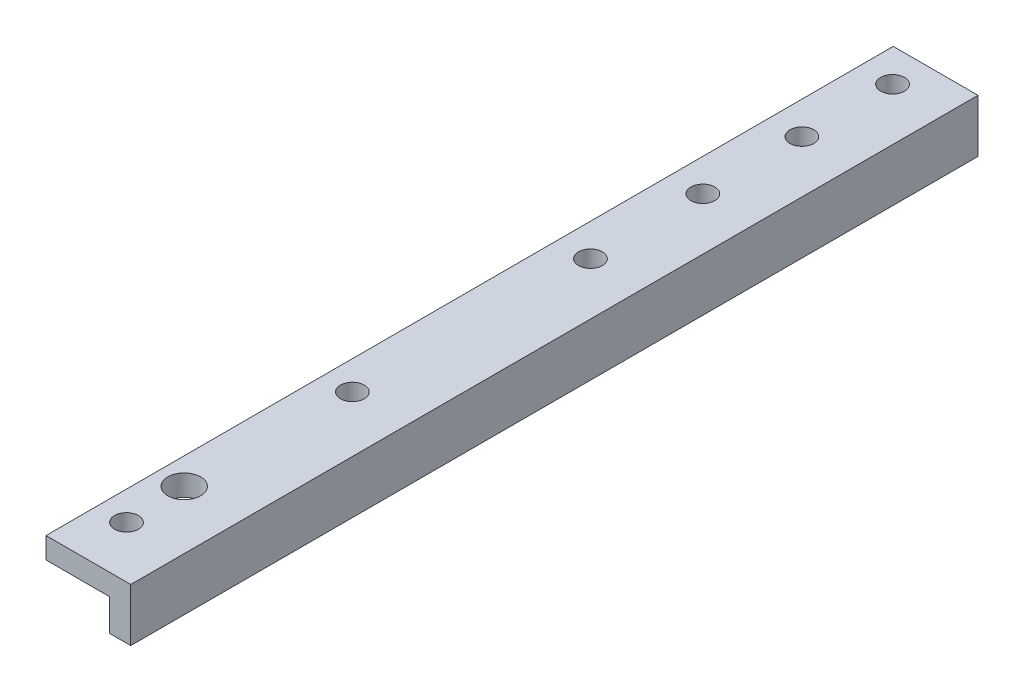
ISO-10303-21;
HEADER;
FILE_DESCRIPTION(('STEP AP214'),'2;1');
FILE_NAME('part.step','',(''),(''),'','','');
FILE_SCHEMA(('AUTOMOTIVE_DESIGN { 1 0 10303 214 1 1 1 1 }'));
ENDSEC;
DATA;
#1=APPLICATION_CONTEXT('core data for automotive mechanical design processes');
#2=APPLICATION_PROTOCOL_DEFINITION('international standard','automotive_design',2000,#1);
#3=PRODUCT_CONTEXT('',#1,'mechanical');
#4=PRODUCT('Part','Part','',(#3));
#5=PRODUCT_RELATED_PRODUCT_CATEGORY('part','',(#4));
#6=PRODUCT_DEFINITION_FORMATION('','',#4);
#7=PRODUCT_DEFINITION_CONTEXT('part definition',#1,'design');
#8=PRODUCT_DEFINITION('design','',#6,#7);
#9=PRODUCT_DEFINITION_SHAPE('','',#8);
#10=(LENGTH_UNIT() NAMED_UNIT(*) SI_UNIT(.MILLI.,.METRE.));
#11=(NAMED_UNIT(*) PLANE_ANGLE_UNIT() SI_UNIT($,.RADIAN.));
#12=(NAMED_UNIT(*) SI_UNIT($,.STERADIAN.) SOLID_ANGLE_UNIT());
#13=UNCERTAINTY_MEASURE_WITH_UNIT(LENGTH_MEASURE(1.E-05),#10,'distance_accuracy_value','');
#14=(GEOMETRIC_REPRESENTATION_CONTEXT(3) GLOBAL_UNCERTAINTY_ASSIGNED_CONTEXT((#13)) GLOBAL_UNIT_ASSIGNED_CONTEXT((#10,
#11,#12)) REPRESENTATION_CONTEXT('',''));
#15=CARTESIAN_POINT('',(0.,0.,0.));
#16=DIRECTION('',(0.,0.,1.));
#17=DIRECTION('',(1.,0.,0.));
#18=AXIS2_PLACEMENT_3D('',#15,#16,#17);
#19=CARTESIAN_POINT('',(16.,-4.,160.));
#20=DIRECTION('',(1.,0.,0.));
#21=DIRECTION('',(0.,0.,-1.));
#22=AXIS2_PLACEMENT_3D('',#19,#20,#21);
#23=PLANE('',#22);
#24=DIRECTION('',(0.,-1.,0.));
#25=VECTOR('',#24,1.);
#26=CARTESIAN_POINT('',(16.,-4.,0.));
#27=LINE('',#26,#25);
#28=CARTESIAN_POINT('',(16.,-4.,0.));
#29=VERTEX_POINT('',#28);
#30=CARTESIAN_POINT('',(16.,-10.,0.));
#31=VERTEX_POINT('',#30);
#32=EDGE_CURVE('E116',#29,#31,#27,.T.);
#33=ORIENTED_EDGE('',*,*,#32,.T.);
#34=DIRECTION('',(0.,0.,-1.));
#35=VECTOR('',#34,1.);
#36=CARTESIAN_POINT('',(16.,-10.,160.));
#37=LINE('',#36,#35);
#38=CARTESIAN_POINT('',(16.,-10.,160.));
#39=VERTEX_POINT('',#38);
#40=EDGE_CURVE('E11',#39,#31,#37,.T.);
#41=ORIENTED_EDGE('',*,*,#40,.F.);
#42=DIRECTION('',(0.,-1.,0.));
#43=VECTOR('',#42,1.);
#44=CARTESIAN_POINT('',(16.,-4.,160.));
#45=LINE('',#44,#43);
#46=CARTESIAN_POINT('',(16.,-4.,160.));
#47=VERTEX_POINT('',#46);
#48=EDGE_CURVE('E128',#47,#39,#45,.T.);
#49=ORIENTED_EDGE('',*,*,#48,.F.);
#50=DIRECTION('',(0.,0.,-1.));
#51=VECTOR('',#50,1.);
#52=CARTESIAN_POINT('',(16.,-4.,160.));
#53=LINE('',#52,#51);
#54=EDGE_CURVE('E112',#47,#29,#53,.T.);
#55=ORIENTED_EDGE('',*,*,#54,.T.);
#56=EDGE_LOOP('',(#33,#41,#49,#55));
#57=FACE_BOUND('',#56,.T.);
#58=ADVANCED_FACE('F33',(#57),#23,.F.);
#59=CARTESIAN_POINT('',(16.,-10.,160.));
#60=DIRECTION('',(0.,1.,0.));
#61=DIRECTION('',(0.,0.,1.));
#62=AXIS2_PLACEMENT_3D('',#59,#60,#61);
#63=PLANE('',#62);
#64=DIRECTION('',(1.,0.,0.));
#65=VECTOR('',#64,1.);
#66=CARTESIAN_POINT('',(16.,-10.,0.));
#67=LINE('',#66,#65);
#68=CARTESIAN_POINT('',(20.,-10.,0.));
#69=VERTEX_POINT('',#68);
#70=EDGE_CURVE('E119',#31,#69,#67,.T.);
#71=ORIENTED_EDGE('',*,*,#70,.T.);
#72=DIRECTION('',(0.,0.,-1.));
#73=VECTOR('',#72,1.);
#74=CARTESIAN_POINT('',(20.,-10.,160.));
#75=LINE('',#74,#73);
#76=CARTESIAN_POINT('',(20.,-10.,160.));
#77=VERTEX_POINT('',#76);
#78=EDGE_CURVE('E41',#77,#69,#75,.T.);
#79=ORIENTED_EDGE('',*,*,#78,.F.);
#80=DIRECTION('',(1.,0.,0.));
#81=VECTOR('',#80,1.);
#82=CARTESIAN_POINT('',(16.,-10.,160.));
#83=LINE('',#82,#81);
#84=EDGE_CURVE('E86',#39,#77,#83,.T.);
#85=ORIENTED_EDGE('',*,*,#84,.F.);
#86=ORIENTED_EDGE('',*,*,#40,.T.);
#87=EDGE_LOOP('',(#71,#79,#85,#86));
#88=FACE_BOUND('',#87,.T.);
#89=ADVANCED_FACE('F155',(#88),#63,.F.);
#90=CARTESIAN_POINT('',(20.,0.,160.));
#91=DIRECTION('',(-1.,0.,0.));
#92=DIRECTION('',(0.,-1.,0.));
#93=AXIS2_PLACEMENT_3D('',#90,#91,#92);
#94=PLANE('',#93);
#95=DIRECTION('',(0.,1.,0.));
#96=VECTOR('',#95,1.);
#97=CARTESIAN_POINT('',(20.,0.,0.));
#98=LINE('',#97,#96);
#99=CARTESIAN_POINT('',(20.,0.,0.));
#100=VERTEX_POINT('',#99);
#101=EDGE_CURVE('E122',#69,#100,#98,.T.);
#102=ORIENTED_EDGE('',*,*,#101,.T.);
#103=DIRECTION('',(0.,0.,-1.));
#104=VECTOR('',#103,1.);
#105=CARTESIAN_POINT('',(20.,0.,160.));
#106=LINE('',#105,#104);
#107=CARTESIAN_POINT('',(20.,0.,160.));
#108=VERTEX_POINT('',#107);
#109=EDGE_CURVE('E107',#108,#100,#106,.T.);
#110=ORIENTED_EDGE('',*,*,#109,.F.);
#111=DIRECTION('',(0.,1.,0.));
#112=VECTOR('',#111,1.);
#113=CARTESIAN_POINT('',(20.,0.,160.));
#114=LINE('',#113,#112);
#115=EDGE_CURVE('E99',#77,#108,#114,.T.);
#116=ORIENTED_EDGE('',*,*,#115,.F.);
#117=ORIENTED_EDGE('',*,*,#78,.T.);
#118=EDGE_LOOP('',(#102,#110,#116,#117));
#119=FACE_BOUND('',#118,.T.);
#120=ADVANCED_FACE('F134',(#119),#94,.F.);
#121=CARTESIAN_POINT('',(16.,0.,160.));
#122=DIRECTION('',(0.,-1.,0.));
#123=DIRECTION('',(1.,0.,0.));
#124=AXIS2_PLACEMENT_3D('',#121,#122,#123);
#125=PLANE('',#124);
#126=CARTESIAN_POINT('',(9.00000000001513,0.,138.89793195105));
#127=DIRECTION('',(0.,-1.,0.));
#128=DIRECTION('',(1.,0.,0.));
#129=AXIS2_PLACEMENT_3D('',#126,#127,#128);
#130=CIRCLE('',#129,3.1);
#131=CARTESIAN_POINT('',(12.1000000000151,0.,138.89793195105));
#132=VERTEX_POINT('',#131);
#133=EDGE_CURVE('E171',#132,#132,#130,.T.);
#134=ORIENTED_EDGE('',*,*,#133,.T.);
#135=EDGE_LOOP('',(#134));
#136=FACE_BOUND('',#135,.T.);
#137=CARTESIAN_POINT('',(10.1289115033545,0.,6.26728637477271));
#138=DIRECTION('',(0.,-1.,0.));
#139=DIRECTION('',(0.,0.,-1.));
#140=AXIS2_PLACEMENT_3D('',#137,#138,#139);
#141=CIRCLE('',#140,2.25);
#142=CARTESIAN_POINT('',(10.1289115033545,0.,4.01728637477272));
#143=VERTEX_POINT('',#142);
#144=EDGE_CURVE('E175',#143,#143,#141,.T.);
#145=ORIENTED_EDGE('',*,*,#144,.T.);
#146=EDGE_LOOP('',(#145));
#147=FACE_BOUND('',#146,.T.);
#148=CARTESIAN_POINT('',(10.1289115033545,0.,23.3815670297532));
#149=DIRECTION('',(0.,-1.,0.));
#150=DIRECTION('',(0.,0.,-1.));
#151=AXIS2_PLACEMENT_3D('',#148,#149,#150);
#152=CIRCLE('',#151,2.25);
#153=CARTESIAN_POINT('',(10.1289115033545,0.,21.1315670297532));
#154=VERTEX_POINT('',#153);
#155=EDGE_CURVE('E179',#154,#154,#152,.T.);
#156=ORIENTED_EDGE('',*,*,#155,.T.);
#157=EDGE_LOOP('',(#156));
#158=FACE_BOUND('',#157,.T.);
#159=CARTESIAN_POINT('',(10.1289115033545,0.,42.0931805458651));
#160=DIRECTION('',(0.,-1.,0.));
#161=DIRECTION('',(0.,0.,-1.));
#162=AXIS2_PLACEMENT_3D('',#159,#160,#161);
#163=CIRCLE('',#162,2.25);
#164=CARTESIAN_POINT('',(10.1289115033545,0.,39.8431805458652));
#165=VERTEX_POINT('',#164);
#166=EDGE_CURVE('E183',#165,#165,#163,.T.);
#167=ORIENTED_EDGE('',*,*,#166,.T.);
#168=EDGE_LOOP('',(#167));
#169=FACE_BOUND('',#168,.T.);
#170=CARTESIAN_POINT('',(10.1289115033545,0.,63.3148885580409));
#171=DIRECTION('',(0.,-1.,0.));
#172=DIRECTION('',(0.,0.,-1.));
#173=AXIS2_PLACEMENT_3D('',#170,#171,#172);
#174=CIRCLE('',#173,2.25);
#175=CARTESIAN_POINT('',(10.1289115033545,0.,61.0648885580409));
#176=VERTEX_POINT('',#175);
#177=EDGE_CURVE('E187',#176,#176,#174,.T.);
#178=ORIENTED_EDGE('',*,*,#177,.T.);
#179=EDGE_LOOP('',(#178));
#180=FACE_BOUND('',#179,.T.);
#181=CARTESIAN_POINT('',(9.44434027715525,0.,107.583827852257));
#182=DIRECTION('',(0.,-1.,0.));
#183=DIRECTION('',(0.,0.,-1.));
#184=AXIS2_PLACEMENT_3D('',#181,#182,#183);
#185=CIRCLE('',#184,2.25);
#186=CARTESIAN_POINT('',(9.44434027715525,0.,105.333827852257));
#187=VERTEX_POINT('',#186);
#188=EDGE_CURVE('E191',#187,#187,#185,.T.);
#189=ORIENTED_EDGE('',*,*,#188,.T.);
#190=EDGE_LOOP('',(#189));
#191=FACE_BOUND('',#190,.T.);
#192=CARTESIAN_POINT('',(9.44434027715525,0.,150.244789298313));
#193=DIRECTION('',(0.,-1.,0.));
#194=DIRECTION('',(0.,0.,-1.));
#195=AXIS2_PLACEMENT_3D('',#192,#193,#194);
#196=CIRCLE('',#195,2.25);
#197=CARTESIAN_POINT('',(9.44434027715525,0.,147.994789298313));
#198=VERTEX_POINT('',#197);
#199=EDGE_CURVE('E120',#198,#198,#196,.T.);
#200=ORIENTED_EDGE('',*,*,#199,.T.);
#201=EDGE_LOOP('',(#200));
#202=FACE_BOUND('',#201,.T.);
#203=DIRECTION('',(-1.,0.,0.));
#204=VECTOR('',#203,1.);
#205=CARTESIAN_POINT('',(16.,0.,0.));
#206=LINE('',#205,#204);
#207=CARTESIAN_POINT('',(4.,0.,0.));
#208=VERTEX_POINT('',#207);
#209=EDGE_CURVE('E106',#100,#208,#206,.T.);
#210=ORIENTED_EDGE('',*,*,#209,.T.);
#211=DIRECTION('',(0.,0.,-1.));
#212=VECTOR('',#211,1.);
#213=CARTESIAN_POINT('',(4.,0.,160.));
#214=LINE('',#213,#212);
#215=CARTESIAN_POINT('',(4.,0.,160.));
#216=VERTEX_POINT('',#215);
#217=EDGE_CURVE('E104',#216,#208,#214,.T.);
#218=ORIENTED_EDGE('',*,*,#217,.F.);
#219=DIRECTION('',(-1.,0.,0.));
#220=VECTOR('',#219,1.);
#221=CARTESIAN_POINT('',(16.,0.,160.));
#222=LINE('',#221,#220);
#223=EDGE_CURVE('E93',#108,#216,#222,.T.);
#224=ORIENTED_EDGE('',*,*,#223,.F.);
#225=ORIENTED_EDGE('',*,*,#109,.T.);
#226=EDGE_LOOP('',(#210,#218,#224,#225));
#227=FACE_BOUND('',#226,.T.);
#228=ADVANCED_FACE('F105',(#136,#147,#158,#169,#180,#191,#202,#227),#125,.F.);
#229=CARTESIAN_POINT('',(4.,0.,160.));
#230=DIRECTION('',(1.,0.,0.));
#231=DIRECTION('',(0.,1.,0.));
#232=AXIS2_PLACEMENT_3D('',#229,#230,#231);
#233=PLANE('',#232);
#234=DIRECTION('',(0.,-1.,0.));
#235=VECTOR('',#234,1.);
#236=CARTESIAN_POINT('',(4.,0.,0.));
#237=LINE('',#236,#235);
#238=CARTESIAN_POINT('',(4.,-4.,0.));
#239=VERTEX_POINT('',#238);
#240=EDGE_CURVE('E72',#208,#239,#237,.T.);
#241=ORIENTED_EDGE('',*,*,#240,.T.);
#242=DIRECTION('',(0.,0.,-1.));
#243=VECTOR('',#242,1.);
#244=CARTESIAN_POINT('',(4.,-4.,160.));
#245=LINE('',#244,#243);
#246=CARTESIAN_POINT('',(4.,-4.,160.));
#247=VERTEX_POINT('',#246);
#248=EDGE_CURVE('E108',#247,#239,#245,.T.);
#249=ORIENTED_EDGE('',*,*,#248,.F.);
#250=DIRECTION('',(0.,-1.,0.));
#251=VECTOR('',#250,1.);
#252=CARTESIAN_POINT('',(4.,0.,160.));
#253=LINE('',#252,#251);
#254=EDGE_CURVE('E97',#216,#247,#253,.T.);
#255=ORIENTED_EDGE('',*,*,#254,.F.);
#256=ORIENTED_EDGE('',*,*,#217,.T.);
#257=EDGE_LOOP('',(#241,#249,#255,#256));
#258=FACE_BOUND('',#257,.T.);
#259=ADVANCED_FACE('F110',(#258),#233,.F.);
#260=CARTESIAN_POINT('',(4.,-4.,160.));
#261=DIRECTION('',(0.,1.,0.));
#262=DIRECTION('',(0.,0.,1.));
#263=AXIS2_PLACEMENT_3D('',#260,#261,#262);
#264=PLANE('',#263);
#265=CARTESIAN_POINT('',(9.00000000001513,-4.,138.89793195105));
#266=DIRECTION('',(0.,-1.,0.));
#267=DIRECTION('',(0.,0.,-1.));
#268=AXIS2_PLACEMENT_3D('',#265,#266,#267);
#269=CIRCLE('',#268,3.1);
#270=CARTESIAN_POINT('',(9.00000000001513,-4.,135.79793195105));
#271=VERTEX_POINT('',#270);
#272=EDGE_CURVE('E223',#271,#271,#269,.T.);
#273=ORIENTED_EDGE('',*,*,#272,.F.);
#274=EDGE_LOOP('',(#273));
#275=FACE_BOUND('',#274,.T.);
#276=CARTESIAN_POINT('',(10.1289115033545,-4.,6.26728637477271));
#277=DIRECTION('',(0.,-1.,0.));
#278=DIRECTION('',(0.,0.,-1.));
#279=AXIS2_PLACEMENT_3D('',#276,#277,#278);
#280=CIRCLE('',#279,2.24999999999999);
#281=CARTESIAN_POINT('',(10.1289115033545,-4.,4.01728637477273));
#282=VERTEX_POINT('',#281);
#283=EDGE_CURVE('E219',#282,#282,#280,.T.);
#284=ORIENTED_EDGE('',*,*,#283,.F.);
#285=EDGE_LOOP('',(#284));
#286=FACE_BOUND('',#285,.T.);
#287=CARTESIAN_POINT('',(10.1289115033545,-4.,23.3815670297532));
#288=DIRECTION('',(0.,-1.,0.));
#289=DIRECTION('',(0.,0.,-1.));
#290=AXIS2_PLACEMENT_3D('',#287,#288,#289);
#291=CIRCLE('',#290,2.24999999999999);
#292=CARTESIAN_POINT('',(10.1289115033545,-4.,21.1315670297532));
#293=VERTEX_POINT('',#292);
#294=EDGE_CURVE('E215',#293,#293,#291,.T.);
#295=ORIENTED_EDGE('',*,*,#294,.F.);
#296=EDGE_LOOP('',(#295));
#297=FACE_BOUND('',#296,.T.);
#298=CARTESIAN_POINT('',(10.1289115033545,-4.,42.0931805458651));
#299=DIRECTION('',(0.,-1.,0.));
#300=DIRECTION('',(0.,0.,-1.));
#301=AXIS2_PLACEMENT_3D('',#298,#299,#300);
#302=CIRCLE('',#301,2.24999999999999);
#303=CARTESIAN_POINT('',(10.1289115033545,-4.,39.8431805458652));
#304=VERTEX_POINT('',#303);
#305=EDGE_CURVE('E211',#304,#304,#302,.T.);
#306=ORIENTED_EDGE('',*,*,#305,.F.);
#307=EDGE_LOOP('',(#306));
#308=FACE_BOUND('',#307,.T.);
#309=CARTESIAN_POINT('',(10.1289115033545,-4.,63.3148885580409));
#310=DIRECTION('',(0.,-1.,0.));
#311=DIRECTION('',(0.,0.,-1.));
#312=AXIS2_PLACEMENT_3D('',#309,#310,#311);
#313=CIRCLE('',#312,2.24999999999999);
#314=CARTESIAN_POINT('',(10.1289115033545,-4.,61.0648885580409));
#315=VERTEX_POINT('',#314);
#316=EDGE_CURVE('E207',#315,#315,#313,.T.);
#317=ORIENTED_EDGE('',*,*,#316,.F.);
#318=EDGE_LOOP('',(#317));
#319=FACE_BOUND('',#318,.T.);
#320=CARTESIAN_POINT('',(9.44434027715525,-4.,107.583827852257));
#321=DIRECTION('',(0.,-1.,0.));
#322=DIRECTION('',(0.,0.,-1.));
#323=AXIS2_PLACEMENT_3D('',#320,#321,#322);
#324=CIRCLE('',#323,2.24999999999999);
#325=CARTESIAN_POINT('',(9.44434027715525,-4.,105.333827852257));
#326=VERTEX_POINT('',#325);
#327=EDGE_CURVE('E203',#326,#326,#324,.T.);
#328=ORIENTED_EDGE('',*,*,#327,.F.);
#329=EDGE_LOOP('',(#328));
#330=FACE_BOUND('',#329,.T.);
#331=CARTESIAN_POINT('',(9.44434027715525,-4.,150.244789298313));
#332=DIRECTION('',(0.,-1.,0.));
#333=DIRECTION('',(0.,0.,-1.));
#334=AXIS2_PLACEMENT_3D('',#331,#332,#333);
#335=CIRCLE('',#334,2.24999999999999);
#336=CARTESIAN_POINT('',(9.44434027715525,-4.,147.994789298313));
#337=VERTEX_POINT('',#336);
#338=EDGE_CURVE('E195',#337,#337,#335,.T.);
#339=ORIENTED_EDGE('',*,*,#338,.F.);
#340=EDGE_LOOP('',(#339));
#341=FACE_BOUND('',#340,.T.);
#342=DIRECTION('',(1.,0.,0.));
#343=VECTOR('',#342,1.);
#344=CARTESIAN_POINT('',(4.,-4.,0.));
#345=LINE('',#344,#343);
#346=EDGE_CURVE('E78',#239,#29,#345,.T.);
#347=ORIENTED_EDGE('',*,*,#346,.T.);
#348=ORIENTED_EDGE('',*,*,#54,.F.);
#349=DIRECTION('',(1.,0.,0.));
#350=VECTOR('',#349,1.);
#351=CARTESIAN_POINT('',(4.,-4.,160.));
#352=LINE('',#351,#350);
#353=EDGE_CURVE('E49',#247,#47,#352,.T.);
#354=ORIENTED_EDGE('',*,*,#353,.F.);
#355=ORIENTED_EDGE('',*,*,#248,.T.);
#356=EDGE_LOOP('',(#347,#348,#354,#355));
#357=FACE_BOUND('',#356,.T.);
#358=ADVANCED_FACE('F141',(#275,#286,#297,#308,#319,#330,#341,#357),#264,.F.);
#359=CARTESIAN_POINT('',(0.,0.,160.));
#360=DIRECTION('',(0.,0.,1.));
#361=DIRECTION('',(1.,0.,0.));
#362=AXIS2_PLACEMENT_3D('',#359,#360,#361);
#363=PLANE('',#362);
#364=ORIENTED_EDGE('',*,*,#48,.T.);
#365=ORIENTED_EDGE('',*,*,#84,.T.);
#366=ORIENTED_EDGE('',*,*,#115,.T.);
#367=ORIENTED_EDGE('',*,*,#223,.T.);
#368=ORIENTED_EDGE('',*,*,#254,.T.);
#369=ORIENTED_EDGE('',*,*,#353,.T.);
#370=EDGE_LOOP('',(#364,#365,#366,#367,#368,#369));
#371=FACE_BOUND('',#370,.T.);
#372=ADVANCED_FACE('F95',(#371),#363,.T.);
#373=CARTESIAN_POINT('',(0.,0.,0.));
#374=DIRECTION('',(0.,0.,1.));
#375=DIRECTION('',(1.,0.,0.));
#376=AXIS2_PLACEMENT_3D('',#373,#374,#375);
#377=PLANE('',#376);
#378=ORIENTED_EDGE('',*,*,#32,.F.);
#379=ORIENTED_EDGE('',*,*,#346,.F.);
#380=ORIENTED_EDGE('',*,*,#240,.F.);
#381=ORIENTED_EDGE('',*,*,#209,.F.);
#382=ORIENTED_EDGE('',*,*,#101,.F.);
#383=ORIENTED_EDGE('',*,*,#70,.F.);
#384=EDGE_LOOP('',(#378,#379,#380,#381,#382,#383));
#385=FACE_BOUND('',#384,.T.);
#386=ADVANCED_FACE('F137',(#385),#377,.F.);
#387=CARTESIAN_POINT('',(9.44434027715525,-4.,150.244789298313));
#388=DIRECTION('',(0.,-1.,0.));
#389=DIRECTION('',(0.,0.,-1.));
#390=AXIS2_PLACEMENT_3D('',#387,#388,#389);
#391=CYLINDRICAL_SURFACE('',#390,2.24999999999999);
#392=ORIENTED_EDGE('',*,*,#199,.F.);
#393=EDGE_LOOP('',(#392));
#394=FACE_BOUND('',#393,.T.);
#395=ORIENTED_EDGE('',*,*,#338,.T.);
#396=EDGE_LOOP('',(#395));
#397=FACE_BOUND('',#396,.T.);
#398=ADVANCED_FACE('F252',(#394,#397),#391,.F.);
#399=CARTESIAN_POINT('',(9.44434027715525,-4.,107.583827852257));
#400=DIRECTION('',(0.,-1.,0.));
#401=DIRECTION('',(0.,0.,-1.));
#402=AXIS2_PLACEMENT_3D('',#399,#400,#401);
#403=CYLINDRICAL_SURFACE('',#402,2.24999999999999);
#404=ORIENTED_EDGE('',*,*,#188,.F.);
#405=EDGE_LOOP('',(#404));
#406=FACE_BOUND('',#405,.T.);
#407=ORIENTED_EDGE('',*,*,#327,.T.);
#408=EDGE_LOOP('',(#407));
#409=FACE_BOUND('',#408,.T.);
#410=ADVANCED_FACE('F248',(#406,#409),#403,.F.);
#411=CARTESIAN_POINT('',(10.1289115033545,-4.,63.3148885580409));
#412=DIRECTION('',(0.,-1.,0.));
#413=DIRECTION('',(0.,0.,-1.));
#414=AXIS2_PLACEMENT_3D('',#411,#412,#413);
#415=CYLINDRICAL_SURFACE('',#414,2.24999999999999);
#416=ORIENTED_EDGE('',*,*,#177,.F.);
#417=EDGE_LOOP('',(#416));
#418=FACE_BOUND('',#417,.T.);
#419=ORIENTED_EDGE('',*,*,#316,.T.);
#420=EDGE_LOOP('',(#419));
#421=FACE_BOUND('',#420,.T.);
#422=ADVANCED_FACE('F244',(#418,#421),#415,.F.);
#423=CARTESIAN_POINT('',(10.1289115033545,-4.,42.0931805458651));
#424=DIRECTION('',(0.,-1.,0.));
#425=DIRECTION('',(0.,0.,-1.));
#426=AXIS2_PLACEMENT_3D('',#423,#424,#425);
#427=CYLINDRICAL_SURFACE('',#426,2.24999999999999);
#428=ORIENTED_EDGE('',*,*,#166,.F.);
#429=EDGE_LOOP('',(#428));
#430=FACE_BOUND('',#429,.T.);
#431=ORIENTED_EDGE('',*,*,#305,.T.);
#432=EDGE_LOOP('',(#431));
#433=FACE_BOUND('',#432,.T.);
#434=ADVANCED_FACE('F240',(#430,#433),#427,.F.);
#435=CARTESIAN_POINT('',(10.1289115033545,-4.,23.3815670297532));
#436=DIRECTION('',(0.,-1.,0.));
#437=DIRECTION('',(0.,0.,-1.));
#438=AXIS2_PLACEMENT_3D('',#435,#436,#437);
#439=CYLINDRICAL_SURFACE('',#438,2.24999999999999);
#440=ORIENTED_EDGE('',*,*,#155,.F.);
#441=EDGE_LOOP('',(#440));
#442=FACE_BOUND('',#441,.T.);
#443=ORIENTED_EDGE('',*,*,#294,.T.);
#444=EDGE_LOOP('',(#443));
#445=FACE_BOUND('',#444,.T.);
#446=ADVANCED_FACE('F234',(#442,#445),#439,.F.);
#447=CARTESIAN_POINT('',(10.1289115033545,-4.,6.26728637477271));
#448=DIRECTION('',(0.,-1.,0.));
#449=DIRECTION('',(0.,0.,-1.));
#450=AXIS2_PLACEMENT_3D('',#447,#448,#449);
#451=CYLINDRICAL_SURFACE('',#450,2.24999999999999);
#452=ORIENTED_EDGE('',*,*,#144,.F.);
#453=EDGE_LOOP('',(#452));
#454=FACE_BOUND('',#453,.T.);
#455=ORIENTED_EDGE('',*,*,#283,.T.);
#456=EDGE_LOOP('',(#455));
#457=FACE_BOUND('',#456,.T.);
#458=ADVANCED_FACE('F229',(#454,#457),#451,.F.);
#459=CARTESIAN_POINT('',(9.00000000001513,11.7681240867133,138.89793195105));
#460=DIRECTION('',(0.,-1.,0.));
#461=DIRECTION('',(0.,0.,-1.));
#462=AXIS2_PLACEMENT_3D('',#459,#460,#461);
#463=CYLINDRICAL_SURFACE('',#462,3.1);
#464=ORIENTED_EDGE('',*,*,#272,.T.);
#465=EDGE_LOOP('',(#464));
#466=FACE_BOUND('',#465,.T.);
#467=ORIENTED_EDGE('',*,*,#133,.F.);
#468=EDGE_LOOP('',(#467));
#469=FACE_BOUND('',#468,.T.);
#470=ADVANCED_FACE('F226',(#466,#469),#463,.F.);
#471=CLOSED_SHELL('',(#58,#89,#120,#228,#259,#358,#372,#386,#398,#410,#422,#434,#446,#458,#470));
#472=MANIFOLD_SOLID_BREP('B2',#471);
#473=ADVANCED_BREP_SHAPE_REPRESENTATION('',(#18,#472),#14);
#474=SHAPE_DEFINITION_REPRESENTATION(#9,#473);
ENDSEC;
END-ISO-10303-21;
